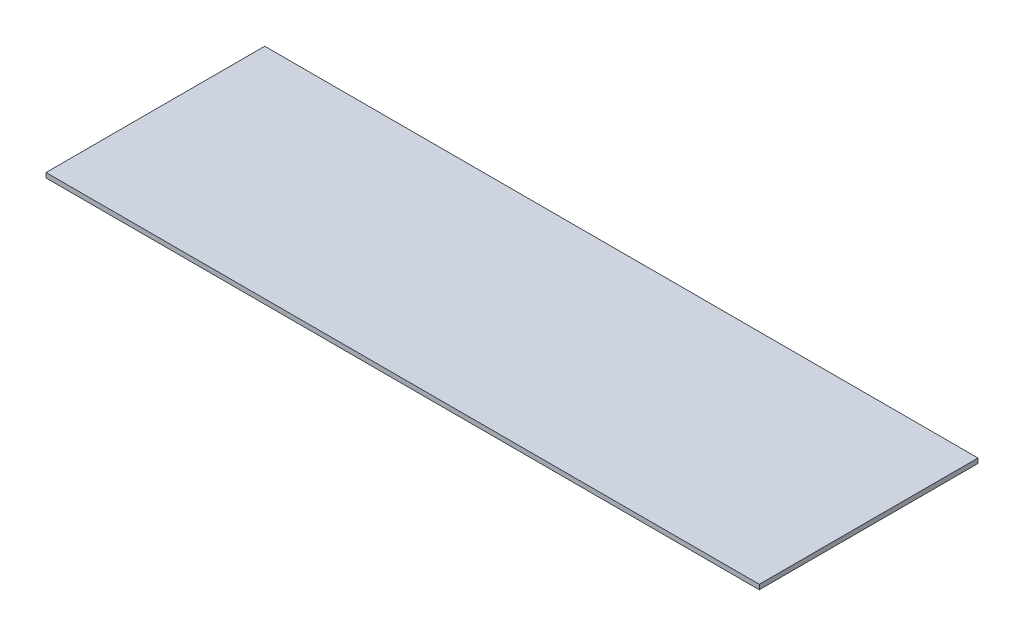
ISO-10303-21;
HEADER;
FILE_DESCRIPTION(('STEP AP214'),'2;1');
FILE_NAME('part.step','',(''),(''),'','','');
FILE_SCHEMA(('AUTOMOTIVE_DESIGN { 1 0 10303 214 1 1 1 1 }'));
ENDSEC;
DATA;
#1=APPLICATION_CONTEXT('core data for automotive mechanical design processes');
#2=APPLICATION_PROTOCOL_DEFINITION('international standard','automotive_design',2000,#1);
#3=PRODUCT_CONTEXT('',#1,'mechanical');
#4=PRODUCT('Part','Part','',(#3));
#5=PRODUCT_RELATED_PRODUCT_CATEGORY('part','',(#4));
#6=PRODUCT_DEFINITION_FORMATION('','',#4);
#7=PRODUCT_DEFINITION_CONTEXT('part definition',#1,'design');
#8=PRODUCT_DEFINITION('design','',#6,#7);
#9=PRODUCT_DEFINITION_SHAPE('','',#8);
#10=(LENGTH_UNIT() NAMED_UNIT(*) SI_UNIT(.MILLI.,.METRE.));
#11=(NAMED_UNIT(*) PLANE_ANGLE_UNIT() SI_UNIT($,.RADIAN.));
#12=(NAMED_UNIT(*) SI_UNIT($,.STERADIAN.) SOLID_ANGLE_UNIT());
#13=UNCERTAINTY_MEASURE_WITH_UNIT(LENGTH_MEASURE(1.E-05),#10,'distance_accuracy_value','');
#14=(GEOMETRIC_REPRESENTATION_CONTEXT(3) GLOBAL_UNCERTAINTY_ASSIGNED_CONTEXT((#13)) GLOBAL_UNIT_ASSIGNED_CONTEXT((#10,
#11,#12)) REPRESENTATION_CONTEXT('',''));
#15=CARTESIAN_POINT('',(0.,0.,0.));
#16=DIRECTION('',(0.,0.,1.));
#17=DIRECTION('',(1.,0.,0.));
#18=AXIS2_PLACEMENT_3D('',#15,#16,#17);
#19=CARTESIAN_POINT('',(-89.1210728294941,3.175,-55.7339246500866));
#20=DIRECTION('',(1.,0.,0.));
#21=DIRECTION('',(0.,0.,-1.));
#22=AXIS2_PLACEMENT_3D('',#19,#20,#21);
#23=PLANE('',#22);
#24=DIRECTION('',(0.,0.,1.));
#25=VECTOR('',#24,1.);
#26=CARTESIAN_POINT('',(-89.1210728294941,0.,-55.7339246500866));
#27=LINE('',#26,#25);
#28=CARTESIAN_POINT('',(-89.1210728294941,0.,-55.7339246500866));
#29=VERTEX_POINT('',#28);
#30=CARTESIAN_POINT('',(-89.1210728294941,0.,90.3160753499134));
#31=VERTEX_POINT('',#30);
#32=EDGE_CURVE('E95',#29,#31,#27,.T.);
#33=ORIENTED_EDGE('',*,*,#32,.T.);
#34=DIRECTION('',(0.,-1.,0.));
#35=VECTOR('',#34,1.);
#36=CARTESIAN_POINT('',(-89.1210728294941,3.175,90.3160753499134));
#37=LINE('',#36,#35);
#38=CARTESIAN_POINT('',(-89.1210728294941,3.175,90.3160753499134));
#39=VERTEX_POINT('',#38);
#40=EDGE_CURVE('E11',#39,#31,#37,.T.);
#41=ORIENTED_EDGE('',*,*,#40,.F.);
#42=DIRECTION('',(0.,0.,1.));
#43=VECTOR('',#42,1.);
#44=CARTESIAN_POINT('',(-89.1210728294941,3.175,-55.7339246500866));
#45=LINE('',#44,#43);
#46=CARTESIAN_POINT('',(-89.1210728294941,3.175,-55.7339246500866));
#47=VERTEX_POINT('',#46);
#48=EDGE_CURVE('E83',#47,#39,#45,.T.);
#49=ORIENTED_EDGE('',*,*,#48,.F.);
#50=DIRECTION('',(0.,-1.,0.));
#51=VECTOR('',#50,1.);
#52=CARTESIAN_POINT('',(-89.1210728294941,3.175,-55.7339246500866));
#53=LINE('',#52,#51);
#54=EDGE_CURVE('E91',#47,#29,#53,.T.);
#55=ORIENTED_EDGE('',*,*,#54,.T.);
#56=EDGE_LOOP('',(#33,#41,#49,#55));
#57=FACE_BOUND('',#56,.T.);
#58=ADVANCED_FACE('F32',(#57),#23,.F.);
#59=CARTESIAN_POINT('',(-89.1210728294941,3.175,90.3160753499134));
#60=DIRECTION('',(0.,0.,-1.));
#61=DIRECTION('',(-1.,0.,0.));
#62=AXIS2_PLACEMENT_3D('',#59,#60,#61);
#63=PLANE('',#62);
#64=DIRECTION('',(1.,0.,0.));
#65=VECTOR('',#64,1.);
#66=CARTESIAN_POINT('',(-89.1210728294941,0.,90.3160753499134));
#67=LINE('',#66,#65);
#68=CARTESIAN_POINT('',(387.128927170506,0.,90.3160753499134));
#69=VERTEX_POINT('',#68);
#70=EDGE_CURVE('E87',#31,#69,#67,.T.);
#71=ORIENTED_EDGE('',*,*,#70,.T.);
#72=DIRECTION('',(0.,-1.,0.));
#73=VECTOR('',#72,1.);
#74=CARTESIAN_POINT('',(387.128927170506,3.175,90.3160753499134));
#75=LINE('',#74,#73);
#76=CARTESIAN_POINT('',(387.128927170506,3.175,90.3160753499134));
#77=VERTEX_POINT('',#76);
#78=EDGE_CURVE('E40',#77,#69,#75,.T.);
#79=ORIENTED_EDGE('',*,*,#78,.F.);
#80=DIRECTION('',(1.,0.,0.));
#81=VECTOR('',#80,1.);
#82=CARTESIAN_POINT('',(-89.1210728294941,3.175,90.3160753499134));
#83=LINE('',#82,#81);
#84=EDGE_CURVE('E78',#39,#77,#83,.T.);
#85=ORIENTED_EDGE('',*,*,#84,.F.);
#86=ORIENTED_EDGE('',*,*,#40,.T.);
#87=EDGE_LOOP('',(#71,#79,#85,#86));
#88=FACE_BOUND('',#87,.T.);
#89=ADVANCED_FACE('F86',(#88),#63,.F.);
#90=CARTESIAN_POINT('',(387.128927170506,3.175,-55.7339246500866));
#91=DIRECTION('',(-1.,0.,0.));
#92=DIRECTION('',(0.,0.,1.));
#93=AXIS2_PLACEMENT_3D('',#90,#91,#92);
#94=PLANE('',#93);
#95=DIRECTION('',(0.,0.,-1.));
#96=VECTOR('',#95,1.);
#97=CARTESIAN_POINT('',(387.128927170506,0.,-55.7339246500866));
#98=LINE('',#97,#96);
#99=CARTESIAN_POINT('',(387.128927170506,0.,-55.7339246500866));
#100=VERTEX_POINT('',#99);
#101=EDGE_CURVE('E65',#69,#100,#98,.T.);
#102=ORIENTED_EDGE('',*,*,#101,.T.);
#103=DIRECTION('',(0.,-1.,0.));
#104=VECTOR('',#103,1.);
#105=CARTESIAN_POINT('',(387.128927170506,3.175,-55.7339246500866));
#106=LINE('',#105,#104);
#107=CARTESIAN_POINT('',(387.128927170506,3.175,-55.7339246500866));
#108=VERTEX_POINT('',#107);
#109=EDGE_CURVE('E88',#108,#100,#106,.T.);
#110=ORIENTED_EDGE('',*,*,#109,.F.);
#111=DIRECTION('',(0.,0.,-1.));
#112=VECTOR('',#111,1.);
#113=CARTESIAN_POINT('',(387.128927170506,3.175,-55.7339246500866));
#114=LINE('',#113,#112);
#115=EDGE_CURVE('E81',#77,#108,#114,.T.);
#116=ORIENTED_EDGE('',*,*,#115,.F.);
#117=ORIENTED_EDGE('',*,*,#78,.T.);
#118=EDGE_LOOP('',(#102,#110,#116,#117));
#119=FACE_BOUND('',#118,.T.);
#120=ADVANCED_FACE('F89',(#119),#94,.F.);
#121=CARTESIAN_POINT('',(-89.1210728294941,3.175,-55.7339246500866));
#122=DIRECTION('',(0.,0.,1.));
#123=DIRECTION('',(1.,0.,0.));
#124=AXIS2_PLACEMENT_3D('',#121,#122,#123);
#125=PLANE('',#124);
#126=DIRECTION('',(-1.,0.,0.));
#127=VECTOR('',#126,1.);
#128=CARTESIAN_POINT('',(-89.1210728294941,0.,-55.7339246500866));
#129=LINE('',#128,#127);
#130=EDGE_CURVE('E71',#100,#29,#129,.T.);
#131=ORIENTED_EDGE('',*,*,#130,.T.);
#132=ORIENTED_EDGE('',*,*,#54,.F.);
#133=DIRECTION('',(-1.,0.,0.));
#134=VECTOR('',#133,1.);
#135=CARTESIAN_POINT('',(-89.1210728294941,3.175,-55.7339246500866));
#136=LINE('',#135,#134);
#137=EDGE_CURVE('E48',#108,#47,#136,.T.);
#138=ORIENTED_EDGE('',*,*,#137,.F.);
#139=ORIENTED_EDGE('',*,*,#109,.T.);
#140=EDGE_LOOP('',(#131,#132,#138,#139));
#141=FACE_BOUND('',#140,.T.);
#142=ADVANCED_FACE('F102',(#141),#125,.F.);
#143=CARTESIAN_POINT('',(-89.1210728294941,3.175,90.3160753499134));
#144=DIRECTION('',(0.,1.,0.));
#145=DIRECTION('',(0.,0.,1.));
#146=AXIS2_PLACEMENT_3D('',#143,#144,#145);
#147=PLANE('',#146);
#148=ORIENTED_EDGE('',*,*,#48,.T.);
#149=ORIENTED_EDGE('',*,*,#84,.T.);
#150=ORIENTED_EDGE('',*,*,#115,.T.);
#151=ORIENTED_EDGE('',*,*,#137,.T.);
#152=EDGE_LOOP('',(#148,#149,#150,#151));
#153=FACE_BOUND('',#152,.T.);
#154=ADVANCED_FACE('F79',(#153),#147,.T.);
#155=CARTESIAN_POINT('',(-89.1210728294941,0.,90.3160753499134));
#156=DIRECTION('',(0.,1.,0.));
#157=DIRECTION('',(0.,0.,1.));
#158=AXIS2_PLACEMENT_3D('',#155,#156,#157);
#159=PLANE('',#158);
#160=ORIENTED_EDGE('',*,*,#32,.F.);
#161=ORIENTED_EDGE('',*,*,#130,.F.);
#162=ORIENTED_EDGE('',*,*,#101,.F.);
#163=ORIENTED_EDGE('',*,*,#70,.F.);
#164=EDGE_LOOP('',(#160,#161,#162,#163));
#165=FACE_BOUND('',#164,.T.);
#166=ADVANCED_FACE('F105',(#165),#159,.F.);
#167=CLOSED_SHELL('',(#58,#89,#120,#142,#154,#166));
#168=MANIFOLD_SOLID_BREP('B2',#167);
#169=ADVANCED_BREP_SHAPE_REPRESENTATION('',(#18,#168),#14);
#170=SHAPE_DEFINITION_REPRESENTATION(#9,#169);
ENDSEC;
END-ISO-10303-21;
